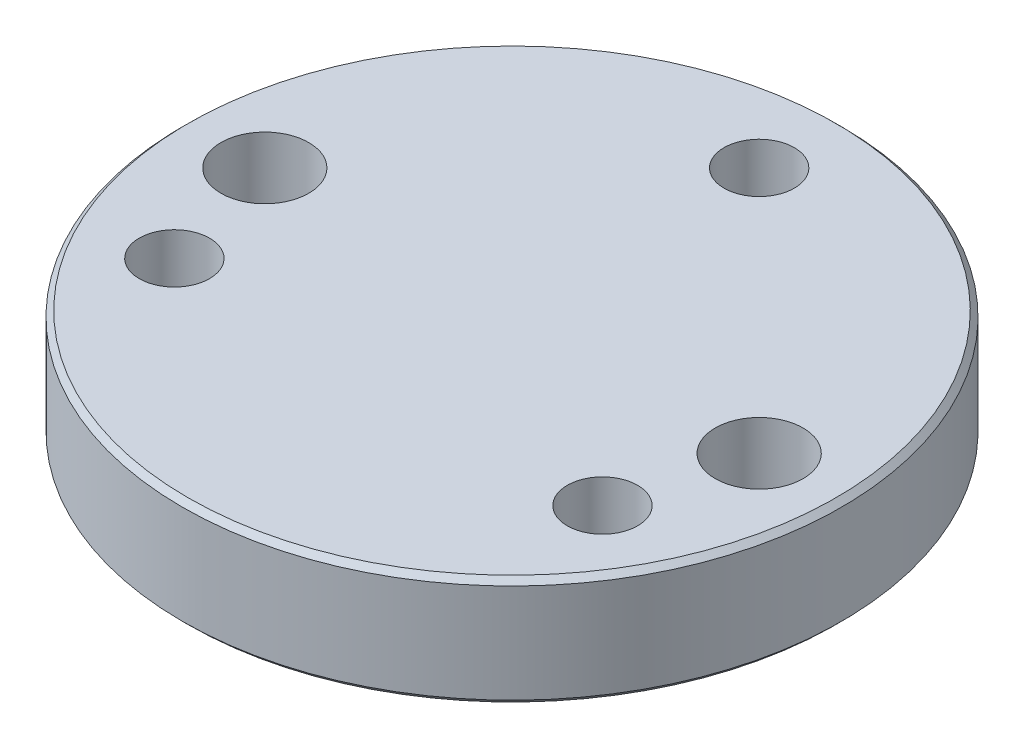
ISO-10303-21;
HEADER;
FILE_DESCRIPTION(('STEP AP214'),'2;1');
FILE_NAME('part.step','',(''),(''),'','','');
FILE_SCHEMA(('AUTOMOTIVE_DESIGN { 1 0 10303 214 1 1 1 1 }'));
ENDSEC;
DATA;
#1=APPLICATION_CONTEXT('core data for automotive mechanical design processes');
#2=APPLICATION_PROTOCOL_DEFINITION('international standard','automotive_design',2000,#1);
#3=PRODUCT_CONTEXT('',#1,'mechanical');
#4=PRODUCT('Part','Part','',(#3));
#5=PRODUCT_RELATED_PRODUCT_CATEGORY('part','',(#4));
#6=PRODUCT_DEFINITION_FORMATION('','',#4);
#7=PRODUCT_DEFINITION_CONTEXT('part definition',#1,'design');
#8=PRODUCT_DEFINITION('design','',#6,#7);
#9=PRODUCT_DEFINITION_SHAPE('','',#8);
#10=(LENGTH_UNIT() NAMED_UNIT(*) SI_UNIT(.MILLI.,.METRE.));
#11=(NAMED_UNIT(*) PLANE_ANGLE_UNIT() SI_UNIT($,.RADIAN.));
#12=(NAMED_UNIT(*) SI_UNIT($,.STERADIAN.) SOLID_ANGLE_UNIT());
#13=UNCERTAINTY_MEASURE_WITH_UNIT(LENGTH_MEASURE(1.E-05),#10,'distance_accuracy_value','');
#14=(GEOMETRIC_REPRESENTATION_CONTEXT(3) GLOBAL_UNCERTAINTY_ASSIGNED_CONTEXT((#13)) GLOBAL_UNIT_ASSIGNED_CONTEXT((#10,
#11,#12)) REPRESENTATION_CONTEXT('',''));
#15=CARTESIAN_POINT('',(0.,0.,0.));
#16=DIRECTION('',(0.,0.,1.));
#17=DIRECTION('',(1.,0.,0.));
#18=AXIS2_PLACEMENT_3D('',#15,#16,#17);
#19=CARTESIAN_POINT('',(0.,-10.,0.));
#20=DIRECTION('',(0.,1.,0.));
#21=DIRECTION('',(0.,0.,1.));
#22=AXIS2_PLACEMENT_3D('',#19,#20,#21);
#23=CYLINDRICAL_SURFACE('',#22,30.);
#24=CARTESIAN_POINT('',(0.,-9.5,0.));
#25=DIRECTION('',(0.,1.,0.));
#26=DIRECTION('',(0.,0.,1.));
#27=AXIS2_PLACEMENT_3D('',#24,#25,#26);
#28=CIRCLE('',#27,30.);
#29=CARTESIAN_POINT('',(0.,-9.5,30.));
#30=VERTEX_POINT('',#29);
#31=EDGE_CURVE('E58',#30,#30,#28,.T.);
#32=ORIENTED_EDGE('',*,*,#31,.T.);
#33=EDGE_LOOP('',(#32));
#34=FACE_BOUND('',#33,.T.);
#35=CARTESIAN_POINT('',(0.,-0.500000000000021,0.));
#36=DIRECTION('',(0.,1.,0.));
#37=DIRECTION('',(0.,0.,1.));
#38=AXIS2_PLACEMENT_3D('',#35,#36,#37);
#39=CIRCLE('',#38,30.);
#40=CARTESIAN_POINT('',(0.,-0.500000000000021,30.));
#41=VERTEX_POINT('',#40);
#42=EDGE_CURVE('E64',#41,#41,#39,.F.);
#43=ORIENTED_EDGE('',*,*,#42,.T.);
#44=EDGE_LOOP('',(#43));
#45=FACE_BOUND('',#44,.T.);
#46=ADVANCED_FACE('F43',(#34,#45),#23,.T.);
#47=CARTESIAN_POINT('',(0.,-10.,0.));
#48=DIRECTION('',(0.,1.,0.));
#49=DIRECTION('',(0.,0.,1.));
#50=AXIS2_PLACEMENT_3D('',#47,#48,#49);
#51=PLANE('',#50);
#52=CARTESIAN_POINT('',(0.,-10.,0.));
#53=DIRECTION('',(0.,1.,0.));
#54=DIRECTION('',(0.,0.,1.));
#55=AXIS2_PLACEMENT_3D('',#52,#53,#54);
#56=CIRCLE('',#55,29.5);
#57=CARTESIAN_POINT('',(0.,-10.,29.5));
#58=VERTEX_POINT('',#57);
#59=EDGE_CURVE('E52',#58,#58,#56,.F.);
#60=ORIENTED_EDGE('',*,*,#59,.T.);
#61=EDGE_LOOP('',(#60));
#62=FACE_BOUND('',#61,.T.);
#63=CARTESIAN_POINT('',(19.48557158515,-10.,11.2499999999998));
#64=DIRECTION('',(0.,1.,0.));
#65=DIRECTION('',(0.,0.,1.));
#66=AXIS2_PLACEMENT_3D('',#63,#64,#65);
#67=CIRCLE('',#66,3.2);
#68=CARTESIAN_POINT('',(19.48557158515,-10.,14.4499999999998));
#69=VERTEX_POINT('',#68);
#70=EDGE_CURVE('E102',#69,#69,#67,.T.);
#71=ORIENTED_EDGE('',*,*,#70,.T.);
#72=EDGE_LOOP('',(#71));
#73=FACE_BOUND('',#72,.T.);
#74=CARTESIAN_POINT('',(-19.4855715851498,-10.,11.2500000000001));
#75=DIRECTION('',(0.,1.,0.));
#76=DIRECTION('',(0.,0.,1.));
#77=AXIS2_PLACEMENT_3D('',#74,#75,#76);
#78=CIRCLE('',#77,3.2);
#79=CARTESIAN_POINT('',(-19.4855715851498,-10.,14.4500000000001));
#80=VERTEX_POINT('',#79);
#81=EDGE_CURVE('E94',#80,#80,#78,.T.);
#82=ORIENTED_EDGE('',*,*,#81,.T.);
#83=EDGE_LOOP('',(#82));
#84=FACE_BOUND('',#83,.T.);
#85=CARTESIAN_POINT('',(0.,-10.,-22.5));
#86=DIRECTION('',(0.,1.,0.));
#87=DIRECTION('',(0.,0.,1.));
#88=AXIS2_PLACEMENT_3D('',#85,#86,#87);
#89=CIRCLE('',#88,3.2);
#90=CARTESIAN_POINT('',(0.,-10.,-19.3));
#91=VERTEX_POINT('',#90);
#92=EDGE_CURVE('E86',#91,#91,#89,.T.);
#93=ORIENTED_EDGE('',*,*,#92,.T.);
#94=EDGE_LOOP('',(#93));
#95=FACE_BOUND('',#94,.T.);
#96=CARTESIAN_POINT('',(-22.5,-10.,0.));
#97=DIRECTION('',(0.,1.,0.));
#98=DIRECTION('',(0.,0.,1.));
#99=AXIS2_PLACEMENT_3D('',#96,#97,#98);
#100=CIRCLE('',#99,4.);
#101=CARTESIAN_POINT('',(-22.5,-10.,4.));
#102=VERTEX_POINT('',#101);
#103=EDGE_CURVE('E78',#102,#102,#100,.T.);
#104=ORIENTED_EDGE('',*,*,#103,.T.);
#105=EDGE_LOOP('',(#104));
#106=FACE_BOUND('',#105,.T.);
#107=CARTESIAN_POINT('',(22.5,-10.,0.));
#108=DIRECTION('',(0.,1.,0.));
#109=DIRECTION('',(0.,0.,1.));
#110=AXIS2_PLACEMENT_3D('',#107,#108,#109);
#111=CIRCLE('',#110,4.);
#112=CARTESIAN_POINT('',(22.5,-10.,4.));
#113=VERTEX_POINT('',#112);
#114=EDGE_CURVE('E70',#113,#113,#111,.T.);
#115=ORIENTED_EDGE('',*,*,#114,.T.);
#116=EDGE_LOOP('',(#115));
#117=FACE_BOUND('',#116,.T.);
#118=ADVANCED_FACE('F118',(#62,#73,#84,#95,#106,#117),#51,.F.);
#119=CARTESIAN_POINT('',(0.,0.,0.));
#120=DIRECTION('',(0.,1.,0.));
#121=DIRECTION('',(0.,0.,1.));
#122=AXIS2_PLACEMENT_3D('',#119,#120,#121);
#123=PLANE('',#122);
#124=CARTESIAN_POINT('',(0.,0.,0.));
#125=DIRECTION('',(0.,1.,0.));
#126=DIRECTION('',(0.,0.,1.));
#127=AXIS2_PLACEMENT_3D('',#124,#125,#126);
#128=CIRCLE('',#127,29.5);
#129=CARTESIAN_POINT('',(0.,0.,29.5));
#130=VERTEX_POINT('',#129);
#131=EDGE_CURVE('E10',#130,#130,#128,.T.);
#132=ORIENTED_EDGE('',*,*,#131,.T.);
#133=EDGE_LOOP('',(#132));
#134=FACE_BOUND('',#133,.T.);
#135=CARTESIAN_POINT('',(19.48557158515,0.,11.2499999999998));
#136=DIRECTION('',(0.,1.,0.));
#137=DIRECTION('',(0.,0.,1.));
#138=AXIS2_PLACEMENT_3D('',#135,#136,#137);
#139=CIRCLE('',#138,3.2);
#140=CARTESIAN_POINT('',(19.48557158515,0.,14.4499999999998));
#141=VERTEX_POINT('',#140);
#142=EDGE_CURVE('E106',#141,#141,#139,.T.);
#143=ORIENTED_EDGE('',*,*,#142,.F.);
#144=EDGE_LOOP('',(#143));
#145=FACE_BOUND('',#144,.T.);
#146=CARTESIAN_POINT('',(-19.4855715851498,0.,11.2500000000001));
#147=DIRECTION('',(0.,1.,0.));
#148=DIRECTION('',(0.,0.,1.));
#149=AXIS2_PLACEMENT_3D('',#146,#147,#148);
#150=CIRCLE('',#149,3.2);
#151=CARTESIAN_POINT('',(-19.4855715851498,0.,14.4500000000001));
#152=VERTEX_POINT('',#151);
#153=EDGE_CURVE('E98',#152,#152,#150,.T.);
#154=ORIENTED_EDGE('',*,*,#153,.F.);
#155=EDGE_LOOP('',(#154));
#156=FACE_BOUND('',#155,.T.);
#157=CARTESIAN_POINT('',(0.,0.,-22.5));
#158=DIRECTION('',(0.,1.,0.));
#159=DIRECTION('',(0.,0.,1.));
#160=AXIS2_PLACEMENT_3D('',#157,#158,#159);
#161=CIRCLE('',#160,3.2);
#162=CARTESIAN_POINT('',(0.,0.,-19.3));
#163=VERTEX_POINT('',#162);
#164=EDGE_CURVE('E90',#163,#163,#161,.T.);
#165=ORIENTED_EDGE('',*,*,#164,.F.);
#166=EDGE_LOOP('',(#165));
#167=FACE_BOUND('',#166,.T.);
#168=CARTESIAN_POINT('',(-22.5,0.,0.));
#169=DIRECTION('',(0.,1.,0.));
#170=DIRECTION('',(0.,0.,1.));
#171=AXIS2_PLACEMENT_3D('',#168,#169,#170);
#172=CIRCLE('',#171,3.99999999999999);
#173=CARTESIAN_POINT('',(-22.5,0.,3.99999999999999));
#174=VERTEX_POINT('',#173);
#175=EDGE_CURVE('E82',#174,#174,#172,.T.);
#176=ORIENTED_EDGE('',*,*,#175,.F.);
#177=EDGE_LOOP('',(#176));
#178=FACE_BOUND('',#177,.T.);
#179=CARTESIAN_POINT('',(22.5,0.,0.));
#180=DIRECTION('',(0.,1.,0.));
#181=DIRECTION('',(0.,0.,1.));
#182=AXIS2_PLACEMENT_3D('',#179,#180,#181);
#183=CIRCLE('',#182,3.99999999999999);
#184=CARTESIAN_POINT('',(22.5,0.,3.99999999999999));
#185=VERTEX_POINT('',#184);
#186=EDGE_CURVE('E74',#185,#185,#183,.T.);
#187=ORIENTED_EDGE('',*,*,#186,.F.);
#188=EDGE_LOOP('',(#187));
#189=FACE_BOUND('',#188,.T.);
#190=ADVANCED_FACE('F114',(#134,#145,#156,#167,#178,#189),#123,.T.);
#191=CARTESIAN_POINT('',(22.5,0.,0.));
#192=DIRECTION('',(0.,1.,0.));
#193=DIRECTION('',(0.,0.,1.));
#194=AXIS2_PLACEMENT_3D('',#191,#192,#193);
#195=CYLINDRICAL_SURFACE('',#194,3.99999999999999);
#196=ORIENTED_EDGE('',*,*,#114,.F.);
#197=EDGE_LOOP('',(#196));
#198=FACE_BOUND('',#197,.T.);
#199=ORIENTED_EDGE('',*,*,#186,.T.);
#200=EDGE_LOOP('',(#199));
#201=FACE_BOUND('',#200,.T.);
#202=ADVANCED_FACE('F117',(#198,#201),#195,.F.);
#203=CARTESIAN_POINT('',(-22.5,0.,0.));
#204=DIRECTION('',(0.,1.,0.));
#205=DIRECTION('',(0.,0.,1.));
#206=AXIS2_PLACEMENT_3D('',#203,#204,#205);
#207=CYLINDRICAL_SURFACE('',#206,3.99999999999999);
#208=ORIENTED_EDGE('',*,*,#103,.F.);
#209=EDGE_LOOP('',(#208));
#210=FACE_BOUND('',#209,.T.);
#211=ORIENTED_EDGE('',*,*,#175,.T.);
#212=EDGE_LOOP('',(#211));
#213=FACE_BOUND('',#212,.T.);
#214=ADVANCED_FACE('F129',(#210,#213),#207,.F.);
#215=CARTESIAN_POINT('',(0.,0.,-22.5));
#216=DIRECTION('',(0.,1.,0.));
#217=DIRECTION('',(0.,0.,1.));
#218=AXIS2_PLACEMENT_3D('',#215,#216,#217);
#219=CYLINDRICAL_SURFACE('',#218,3.2);
#220=ORIENTED_EDGE('',*,*,#92,.F.);
#221=EDGE_LOOP('',(#220));
#222=FACE_BOUND('',#221,.T.);
#223=ORIENTED_EDGE('',*,*,#164,.T.);
#224=EDGE_LOOP('',(#223));
#225=FACE_BOUND('',#224,.T.);
#226=ADVANCED_FACE('F135',(#222,#225),#219,.F.);
#227=CARTESIAN_POINT('',(-19.4855715851498,0.,11.2500000000001));
#228=DIRECTION('',(0.,1.,0.));
#229=DIRECTION('',(0.,0.,1.));
#230=AXIS2_PLACEMENT_3D('',#227,#228,#229);
#231=CYLINDRICAL_SURFACE('',#230,3.2);
#232=ORIENTED_EDGE('',*,*,#81,.F.);
#233=EDGE_LOOP('',(#232));
#234=FACE_BOUND('',#233,.T.);
#235=ORIENTED_EDGE('',*,*,#153,.T.);
#236=EDGE_LOOP('',(#235));
#237=FACE_BOUND('',#236,.T.);
#238=ADVANCED_FACE('F158',(#234,#237),#231,.F.);
#239=CARTESIAN_POINT('',(19.48557158515,0.,11.2499999999998));
#240=DIRECTION('',(0.,1.,0.));
#241=DIRECTION('',(0.,0.,1.));
#242=AXIS2_PLACEMENT_3D('',#239,#240,#241);
#243=CYLINDRICAL_SURFACE('',#242,3.2);
#244=ORIENTED_EDGE('',*,*,#70,.F.);
#245=EDGE_LOOP('',(#244));
#246=FACE_BOUND('',#245,.T.);
#247=ORIENTED_EDGE('',*,*,#142,.T.);
#248=EDGE_LOOP('',(#247));
#249=FACE_BOUND('',#248,.T.);
#250=ADVANCED_FACE('F112',(#246,#249),#243,.F.);
#251=CARTESIAN_POINT('',(0.,-9.5,0.));
#252=DIRECTION('',(0.,1.,0.));
#253=DIRECTION('',(0.,0.,1.));
#254=AXIS2_PLACEMENT_3D('',#251,#252,#253);
#255=CONICAL_SURFACE('',#254,30.,0.785398163397448);
#256=ORIENTED_EDGE('',*,*,#59,.F.);
#257=EDGE_LOOP('',(#256));
#258=FACE_BOUND('',#257,.T.);
#259=ORIENTED_EDGE('',*,*,#31,.F.);
#260=EDGE_LOOP('',(#259));
#261=FACE_BOUND('',#260,.T.);
#262=ADVANCED_FACE('F149',(#258,#261),#255,.T.);
#263=CARTESIAN_POINT('',(0.,0.,0.));
#264=DIRECTION('',(0.,-1.,0.));
#265=DIRECTION('',(0.,0.,-1.));
#266=AXIS2_PLACEMENT_3D('',#263,#264,#265);
#267=CONICAL_SURFACE('',#266,29.5,0.785398163397434);
#268=ORIENTED_EDGE('',*,*,#42,.F.);
#269=EDGE_LOOP('',(#268));
#270=FACE_BOUND('',#269,.T.);
#271=ORIENTED_EDGE('',*,*,#131,.F.);
#272=EDGE_LOOP('',(#271));
#273=FACE_BOUND('',#272,.T.);
#274=ADVANCED_FACE('F46',(#270,#273),#267,.T.);
#275=CLOSED_SHELL('',(#46,#118,#190,#202,#214,#226,#238,#250,#262,#274));
#276=MANIFOLD_SOLID_BREP('B2',#275);
#277=ADVANCED_BREP_SHAPE_REPRESENTATION('',(#18,#276),#14);
#278=SHAPE_DEFINITION_REPRESENTATION(#9,#277);
ENDSEC;
END-ISO-10303-21;
